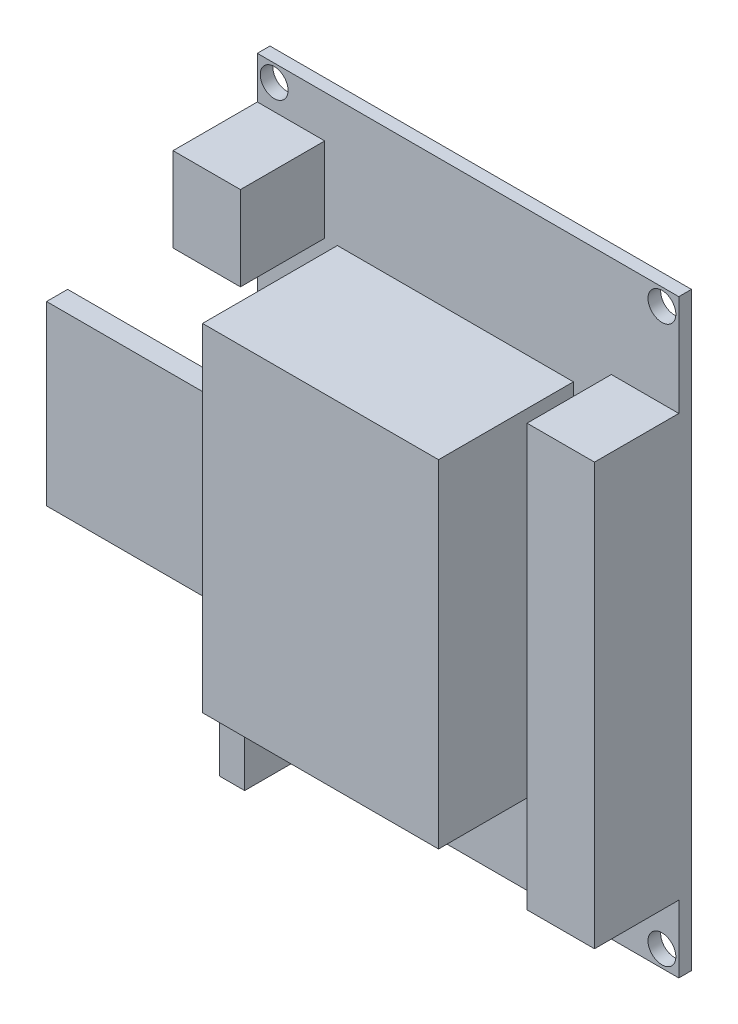
ISO-10303-21;
HEADER;
FILE_DESCRIPTION(('STEP AP214'),'2;1');
FILE_NAME('part.step','',(''),(''),'','','');
FILE_SCHEMA(('AUTOMOTIVE_DESIGN { 1 0 10303 214 1 1 1 1 }'));
ENDSEC;
DATA;
#1=APPLICATION_CONTEXT('core data for automotive mechanical design processes');
#2=APPLICATION_PROTOCOL_DEFINITION('international standard','automotive_design',2000,#1);
#3=PRODUCT_CONTEXT('',#1,'mechanical');
#4=PRODUCT('Part','Part','',(#3));
#5=PRODUCT_RELATED_PRODUCT_CATEGORY('part','',(#4));
#6=PRODUCT_DEFINITION_FORMATION('','',#4);
#7=PRODUCT_DEFINITION_CONTEXT('part definition',#1,'design');
#8=PRODUCT_DEFINITION('design','',#6,#7);
#9=PRODUCT_DEFINITION_SHAPE('','',#8);
#10=(LENGTH_UNIT() NAMED_UNIT(*) SI_UNIT(.MILLI.,.METRE.));
#11=(NAMED_UNIT(*) PLANE_ANGLE_UNIT() SI_UNIT($,.RADIAN.));
#12=(NAMED_UNIT(*) SI_UNIT($,.STERADIAN.) SOLID_ANGLE_UNIT());
#13=UNCERTAINTY_MEASURE_WITH_UNIT(LENGTH_MEASURE(1.E-05),#10,'distance_accuracy_value','');
#14=(GEOMETRIC_REPRESENTATION_CONTEXT(3) GLOBAL_UNCERTAINTY_ASSIGNED_CONTEXT((#13)) GLOBAL_UNIT_ASSIGNED_CONTEXT((#10,
#11,#12)) REPRESENTATION_CONTEXT('',''));
#15=CARTESIAN_POINT('',(0.,0.,0.));
#16=DIRECTION('',(0.,0.,1.));
#17=DIRECTION('',(1.,0.,0.));
#18=AXIS2_PLACEMENT_3D('',#15,#16,#17);
#19=CARTESIAN_POINT('',(0.,0.,0.));
#20=DIRECTION('',(0.,0.,1.));
#21=DIRECTION('',(1.,0.,0.));
#22=AXIS2_PLACEMENT_3D('',#19,#20,#21);
#23=PLANE('',#22);
#24=CARTESIAN_POINT('',(2.00000000000002,2.,0.));
#25=DIRECTION('',(0.,0.,1.));
#26=DIRECTION('',(1.,0.,0.));
#27=AXIS2_PLACEMENT_3D('',#24,#25,#26);
#28=CIRCLE('',#27,1.65);
#29=CARTESIAN_POINT('',(3.65000000000002,2.,0.));
#30=VERTEX_POINT('',#29);
#31=EDGE_CURVE('E549',#30,#30,#28,.F.);
#32=ORIENTED_EDGE('',*,*,#31,.F.);
#33=EDGE_LOOP('',(#32));
#34=FACE_BOUND('',#33,.T.);
#35=CARTESIAN_POINT('',(48.,2.,0.));
#36=DIRECTION('',(0.,0.,1.));
#37=DIRECTION('',(1.,0.,0.));
#38=AXIS2_PLACEMENT_3D('',#35,#36,#37);
#39=CIRCLE('',#38,1.65);
#40=CARTESIAN_POINT('',(49.65,2.,0.));
#41=VERTEX_POINT('',#40);
#42=EDGE_CURVE('E546',#41,#41,#39,.T.);
#43=ORIENTED_EDGE('',*,*,#42,.T.);
#44=EDGE_LOOP('',(#43));
#45=FACE_BOUND('',#44,.T.);
#46=CARTESIAN_POINT('',(48.,68.,0.));
#47=DIRECTION('',(0.,0.,1.));
#48=DIRECTION('',(1.,0.,0.));
#49=AXIS2_PLACEMENT_3D('',#46,#47,#48);
#50=CIRCLE('',#49,1.65);
#51=CARTESIAN_POINT('',(49.65,68.,0.));
#52=VERTEX_POINT('',#51);
#53=EDGE_CURVE('E543',#52,#52,#50,.F.);
#54=ORIENTED_EDGE('',*,*,#53,.F.);
#55=EDGE_LOOP('',(#54));
#56=FACE_BOUND('',#55,.T.);
#57=CARTESIAN_POINT('',(2.,68.,0.));
#58=DIRECTION('',(0.,0.,1.));
#59=DIRECTION('',(1.,0.,0.));
#60=AXIS2_PLACEMENT_3D('',#57,#58,#59);
#61=CIRCLE('',#60,1.65);
#62=CARTESIAN_POINT('',(3.65,68.,0.));
#63=VERTEX_POINT('',#62);
#64=EDGE_CURVE('E533',#63,#63,#61,.T.);
#65=ORIENTED_EDGE('',*,*,#64,.T.);
#66=EDGE_LOOP('',(#65));
#67=FACE_BOUND('',#66,.T.);
#68=DIRECTION('',(1.,0.,0.));
#69=VECTOR('',#68,1.);
#70=CARTESIAN_POINT('',(0.,0.,0.));
#71=LINE('',#70,#69);
#72=CARTESIAN_POINT('',(0.,0.,0.));
#73=VERTEX_POINT('',#72);
#74=CARTESIAN_POINT('',(50.,0.,0.));
#75=VERTEX_POINT('',#74);
#76=EDGE_CURVE('E478',#73,#75,#71,.T.);
#77=ORIENTED_EDGE('',*,*,#76,.F.);
#78=DIRECTION('',(0.,1.,0.));
#79=VECTOR('',#78,1.);
#80=CARTESIAN_POINT('',(0.,0.,0.));
#81=LINE('',#80,#79);
#82=CARTESIAN_POINT('',(0.,70.,0.));
#83=VERTEX_POINT('',#82);
#84=EDGE_CURVE('E530',#73,#83,#81,.T.);
#85=ORIENTED_EDGE('',*,*,#84,.T.);
#86=DIRECTION('',(1.,0.,0.));
#87=VECTOR('',#86,1.);
#88=CARTESIAN_POINT('',(0.,70.,0.));
#89=LINE('',#88,#87);
#90=CARTESIAN_POINT('',(50.,70.,0.));
#91=VERTEX_POINT('',#90);
#92=EDGE_CURVE('E534',#83,#91,#89,.T.);
#93=ORIENTED_EDGE('',*,*,#92,.T.);
#94=DIRECTION('',(0.,1.,0.));
#95=VECTOR('',#94,1.);
#96=CARTESIAN_POINT('',(50.,0.,0.));
#97=LINE('',#96,#95);
#98=EDGE_CURVE('E536',#75,#91,#97,.T.);
#99=ORIENTED_EDGE('',*,*,#98,.F.);
#100=EDGE_LOOP('',(#77,#85,#93,#99));
#101=FACE_BOUND('',#100,.T.);
#102=DIRECTION('',(0.,-1.,0.));
#103=VECTOR('',#102,1.);
#104=CARTESIAN_POINT('',(37.5,0.,0.));
#105=LINE('',#104,#103);
#106=CARTESIAN_POINT('',(37.5,55.,0.));
#107=VERTEX_POINT('',#106);
#108=CARTESIAN_POINT('',(37.5,15.,0.));
#109=VERTEX_POINT('',#108);
#110=EDGE_CURVE('E165',#107,#109,#105,.T.);
#111=ORIENTED_EDGE('',*,*,#110,.F.);
#112=DIRECTION('',(1.,0.,0.));
#113=VECTOR('',#112,1.);
#114=CARTESIAN_POINT('',(0.,55.,0.));
#115=LINE('',#114,#113);
#116=CARTESIAN_POINT('',(9.49999999999999,55.,0.));
#117=VERTEX_POINT('',#116);
#118=EDGE_CURVE('E348',#117,#107,#115,.T.);
#119=ORIENTED_EDGE('',*,*,#118,.F.);
#120=DIRECTION('',(0.,-1.,0.));
#121=VECTOR('',#120,1.);
#122=CARTESIAN_POINT('',(9.50000000000001,0.,0.));
#123=LINE('',#122,#121);
#124=CARTESIAN_POINT('',(9.50000000000001,15.,0.));
#125=VERTEX_POINT('',#124);
#126=EDGE_CURVE('E358',#117,#125,#123,.T.);
#127=ORIENTED_EDGE('',*,*,#126,.T.);
#128=DIRECTION('',(1.,0.,0.));
#129=VECTOR('',#128,1.);
#130=CARTESIAN_POINT('',(0.,15.,0.));
#131=LINE('',#130,#129);
#132=EDGE_CURVE('E355',#125,#109,#131,.T.);
#133=ORIENTED_EDGE('',*,*,#132,.T.);
#134=EDGE_LOOP('',(#111,#119,#127,#133));
#135=FACE_BOUND('',#134,.T.);
#136=ADVANCED_FACE('F150',(#34,#45,#56,#67,#101,#135),#23,.F.);
#137=CARTESIAN_POINT('',(2.00000000000002,2.,1.5));
#138=DIRECTION('',(0.,0.,-1.));
#139=DIRECTION('',(-1.,0.,0.));
#140=AXIS2_PLACEMENT_3D('',#137,#138,#139);
#141=CYLINDRICAL_SURFACE('',#140,1.65);
#142=CARTESIAN_POINT('',(2.00000000000002,2.,1.5));
#143=DIRECTION('',(0.,0.,1.));
#144=DIRECTION('',(1.,0.,0.));
#145=AXIS2_PLACEMENT_3D('',#142,#143,#144);
#146=CIRCLE('',#145,1.65);
#147=CARTESIAN_POINT('',(3.65000000000002,2.,1.5));
#148=VERTEX_POINT('',#147);
#149=EDGE_CURVE('E526',#148,#148,#146,.F.);
#150=ORIENTED_EDGE('',*,*,#149,.F.);
#151=EDGE_LOOP('',(#150));
#152=FACE_BOUND('',#151,.T.);
#153=ORIENTED_EDGE('',*,*,#31,.T.);
#154=EDGE_LOOP('',(#153));
#155=FACE_BOUND('',#154,.T.);
#156=ADVANCED_FACE('F607',(#152,#155),#141,.F.);
#157=CARTESIAN_POINT('',(48.,2.,1.5));
#158=DIRECTION('',(0.,0.,-1.));
#159=DIRECTION('',(-1.,0.,0.));
#160=AXIS2_PLACEMENT_3D('',#157,#158,#159);
#161=CYLINDRICAL_SURFACE('',#160,1.65);
#162=CARTESIAN_POINT('',(48.,2.,1.5));
#163=DIRECTION('',(0.,0.,1.));
#164=DIRECTION('',(1.,0.,0.));
#165=AXIS2_PLACEMENT_3D('',#162,#163,#164);
#166=CIRCLE('',#165,1.65);
#167=CARTESIAN_POINT('',(49.65,2.,1.5));
#168=VERTEX_POINT('',#167);
#169=EDGE_CURVE('E523',#168,#168,#166,.T.);
#170=ORIENTED_EDGE('',*,*,#169,.T.);
#171=EDGE_LOOP('',(#170));
#172=FACE_BOUND('',#171,.T.);
#173=ORIENTED_EDGE('',*,*,#42,.F.);
#174=EDGE_LOOP('',(#173));
#175=FACE_BOUND('',#174,.T.);
#176=ADVANCED_FACE('F615',(#172,#175),#161,.F.);
#177=CARTESIAN_POINT('',(48.,68.,1.5));
#178=DIRECTION('',(0.,0.,-1.));
#179=DIRECTION('',(-1.,0.,0.));
#180=AXIS2_PLACEMENT_3D('',#177,#178,#179);
#181=CYLINDRICAL_SURFACE('',#180,1.65);
#182=CARTESIAN_POINT('',(48.,68.,1.5));
#183=DIRECTION('',(0.,0.,1.));
#184=DIRECTION('',(1.,0.,0.));
#185=AXIS2_PLACEMENT_3D('',#182,#183,#184);
#186=CIRCLE('',#185,1.65);
#187=CARTESIAN_POINT('',(49.65,68.,1.5));
#188=VERTEX_POINT('',#187);
#189=EDGE_CURVE('E520',#188,#188,#186,.F.);
#190=ORIENTED_EDGE('',*,*,#189,.F.);
#191=EDGE_LOOP('',(#190));
#192=FACE_BOUND('',#191,.T.);
#193=ORIENTED_EDGE('',*,*,#53,.T.);
#194=EDGE_LOOP('',(#193));
#195=FACE_BOUND('',#194,.T.);
#196=ADVANCED_FACE('F625',(#192,#195),#181,.F.);
#197=CARTESIAN_POINT('',(2.,68.,1.5));
#198=DIRECTION('',(0.,0.,-1.));
#199=DIRECTION('',(-1.,0.,0.));
#200=AXIS2_PLACEMENT_3D('',#197,#198,#199);
#201=CYLINDRICAL_SURFACE('',#200,1.65);
#202=CARTESIAN_POINT('',(2.,68.,1.5));
#203=DIRECTION('',(0.,0.,1.));
#204=DIRECTION('',(1.,0.,0.));
#205=AXIS2_PLACEMENT_3D('',#202,#203,#204);
#206=CIRCLE('',#205,1.65);
#207=CARTESIAN_POINT('',(3.65,68.,1.5));
#208=VERTEX_POINT('',#207);
#209=EDGE_CURVE('E517',#208,#208,#206,.T.);
#210=ORIENTED_EDGE('',*,*,#209,.T.);
#211=EDGE_LOOP('',(#210));
#212=FACE_BOUND('',#211,.T.);
#213=ORIENTED_EDGE('',*,*,#64,.F.);
#214=EDGE_LOOP('',(#213));
#215=FACE_BOUND('',#214,.T.);
#216=ADVANCED_FACE('F629',(#212,#215),#201,.F.);
#217=CARTESIAN_POINT('',(0.,0.,1.5));
#218=DIRECTION('',(0.,1.,0.));
#219=DIRECTION('',(0.,0.,1.));
#220=AXIS2_PLACEMENT_3D('',#217,#218,#219);
#221=PLANE('',#220);
#222=ORIENTED_EDGE('',*,*,#76,.T.);
#223=DIRECTION('',(0.,0.,-1.));
#224=VECTOR('',#223,1.);
#225=CARTESIAN_POINT('',(50.,0.,1.5));
#226=LINE('',#225,#224);
#227=CARTESIAN_POINT('',(50.,0.,1.5));
#228=VERTEX_POINT('',#227);
#229=EDGE_CURVE('E555',#228,#75,#226,.T.);
#230=ORIENTED_EDGE('',*,*,#229,.F.);
#231=DIRECTION('',(1.,0.,0.));
#232=VECTOR('',#231,1.);
#233=CARTESIAN_POINT('',(0.,0.,1.5));
#234=LINE('',#233,#232);
#235=CARTESIAN_POINT('',(0.,0.,1.5));
#236=VERTEX_POINT('',#235);
#237=EDGE_CURVE('E507',#236,#228,#234,.T.);
#238=ORIENTED_EDGE('',*,*,#237,.F.);
#239=DIRECTION('',(0.,0.,-1.));
#240=VECTOR('',#239,1.);
#241=CARTESIAN_POINT('',(0.,0.,1.5));
#242=LINE('',#241,#240);
#243=EDGE_CURVE('E558',#236,#73,#242,.T.);
#244=ORIENTED_EDGE('',*,*,#243,.T.);
#245=EDGE_LOOP('',(#222,#230,#238,#244));
#246=FACE_BOUND('',#245,.T.);
#247=ADVANCED_FACE('F152',(#246),#221,.F.);
#248=CARTESIAN_POINT('',(50.,0.,1.5));
#249=DIRECTION('',(-1.,0.,0.));
#250=DIRECTION('',(0.,0.,1.));
#251=AXIS2_PLACEMENT_3D('',#248,#249,#250);
#252=PLANE('',#251);
#253=ORIENTED_EDGE('',*,*,#98,.T.);
#254=DIRECTION('',(0.,0.,-1.));
#255=VECTOR('',#254,1.);
#256=CARTESIAN_POINT('',(50.,70.,1.5));
#257=LINE('',#256,#255);
#258=CARTESIAN_POINT('',(50.,70.,1.5));
#259=VERTEX_POINT('',#258);
#260=EDGE_CURVE('E553',#259,#91,#257,.T.);
#261=ORIENTED_EDGE('',*,*,#260,.F.);
#262=DIRECTION('',(0.,1.,0.));
#263=VECTOR('',#262,1.);
#264=CARTESIAN_POINT('',(50.,0.,1.5));
#265=LINE('',#264,#263);
#266=CARTESIAN_POINT('',(50.,58.,1.5));
#267=VERTEX_POINT('',#266);
#268=EDGE_CURVE('E510',#267,#259,#265,.T.);
#269=ORIENTED_EDGE('',*,*,#268,.F.);
#270=DIRECTION('',(0.,0.,-1.));
#271=VECTOR('',#270,1.);
#272=CARTESIAN_POINT('',(50.,58.,11.5));
#273=LINE('',#272,#271);
#274=CARTESIAN_POINT('',(50.,58.,11.5));
#275=VERTEX_POINT('',#274);
#276=EDGE_CURVE('E461',#275,#267,#273,.T.);
#277=ORIENTED_EDGE('',*,*,#276,.F.);
#278=DIRECTION('',(0.,-1.,0.));
#279=VECTOR('',#278,1.);
#280=CARTESIAN_POINT('',(50.,0.,11.5));
#281=LINE('',#280,#279);
#282=CARTESIAN_POINT('',(50.,8.,11.5));
#283=VERTEX_POINT('',#282);
#284=EDGE_CURVE('E458',#275,#283,#281,.T.);
#285=ORIENTED_EDGE('',*,*,#284,.T.);
#286=DIRECTION('',(0.,0.,-1.));
#287=VECTOR('',#286,1.);
#288=CARTESIAN_POINT('',(50.,8.,11.5));
#289=LINE('',#288,#287);
#290=CARTESIAN_POINT('',(50.,8.,1.5));
#291=VERTEX_POINT('',#290);
#292=EDGE_CURVE('E471',#283,#291,#289,.T.);
#293=ORIENTED_EDGE('',*,*,#292,.T.);
#294=EDGE_CURVE('E511',#228,#291,#265,.T.);
#295=ORIENTED_EDGE('',*,*,#294,.F.);
#296=ORIENTED_EDGE('',*,*,#229,.T.);
#297=EDGE_LOOP('',(#253,#261,#269,#277,#285,#293,#295,#296));
#298=FACE_BOUND('',#297,.T.);
#299=ADVANCED_FACE('F640',(#298),#252,.F.);
#300=CARTESIAN_POINT('',(0.,70.,1.5));
#301=DIRECTION('',(0.,1.,0.));
#302=DIRECTION('',(0.,0.,1.));
#303=AXIS2_PLACEMENT_3D('',#300,#301,#302);
#304=PLANE('',#303);
#305=ORIENTED_EDGE('',*,*,#92,.F.);
#306=DIRECTION('',(0.,0.,-1.));
#307=VECTOR('',#306,1.);
#308=CARTESIAN_POINT('',(0.,70.,1.5));
#309=LINE('',#308,#307);
#310=CARTESIAN_POINT('',(0.,70.,1.5));
#311=VERTEX_POINT('',#310);
#312=EDGE_CURVE('E529',#311,#83,#309,.T.);
#313=ORIENTED_EDGE('',*,*,#312,.F.);
#314=DIRECTION('',(1.,0.,0.));
#315=VECTOR('',#314,1.);
#316=CARTESIAN_POINT('',(0.,70.,1.5));
#317=LINE('',#316,#315);
#318=EDGE_CURVE('E514',#311,#259,#317,.T.);
#319=ORIENTED_EDGE('',*,*,#318,.T.);
#320=ORIENTED_EDGE('',*,*,#260,.T.);
#321=EDGE_LOOP('',(#305,#313,#319,#320));
#322=FACE_BOUND('',#321,.T.);
#323=ADVANCED_FACE('F637',(#322),#304,.T.);
#324=CARTESIAN_POINT('',(0.,0.,1.5));
#325=DIRECTION('',(-1.,0.,0.));
#326=DIRECTION('',(0.,0.,1.));
#327=AXIS2_PLACEMENT_3D('',#324,#325,#326);
#328=PLANE('',#327);
#329=ORIENTED_EDGE('',*,*,#84,.F.);
#330=ORIENTED_EDGE('',*,*,#243,.F.);
#331=DIRECTION('',(0.,1.,0.));
#332=VECTOR('',#331,1.);
#333=CARTESIAN_POINT('',(0.,0.,1.5));
#334=LINE('',#333,#332);
#335=CARTESIAN_POINT('',(0.,55.,1.5));
#336=VERTEX_POINT('',#335);
#337=EDGE_CURVE('E504',#236,#336,#334,.T.);
#338=ORIENTED_EDGE('',*,*,#337,.T.);
#339=DIRECTION('',(0.,0.,-1.));
#340=VECTOR('',#339,1.);
#341=CARTESIAN_POINT('',(0.,55.,11.5));
#342=LINE('',#341,#340);
#343=CARTESIAN_POINT('',(0.,55.,11.5));
#344=VERTEX_POINT('',#343);
#345=EDGE_CURVE('E440',#344,#336,#342,.T.);
#346=ORIENTED_EDGE('',*,*,#345,.F.);
#347=DIRECTION('',(0.,1.,0.));
#348=VECTOR('',#347,1.);
#349=CARTESIAN_POINT('',(0.,0.,11.5));
#350=LINE('',#349,#348);
#351=CARTESIAN_POINT('',(0.,65.,11.5));
#352=VERTEX_POINT('',#351);
#353=EDGE_CURVE('E492',#344,#352,#350,.T.);
#354=ORIENTED_EDGE('',*,*,#353,.T.);
#355=DIRECTION('',(0.,0.,-1.));
#356=VECTOR('',#355,1.);
#357=CARTESIAN_POINT('',(0.,65.,11.5));
#358=LINE('',#357,#356);
#359=CARTESIAN_POINT('',(0.,65.,1.5));
#360=VERTEX_POINT('',#359);
#361=EDGE_CURVE('E479',#352,#360,#358,.T.);
#362=ORIENTED_EDGE('',*,*,#361,.T.);
#363=EDGE_CURVE('E508',#360,#311,#334,.T.);
#364=ORIENTED_EDGE('',*,*,#363,.T.);
#365=ORIENTED_EDGE('',*,*,#312,.T.);
#366=EDGE_LOOP('',(#329,#330,#338,#346,#354,#362,#364,#365));
#367=FACE_BOUND('',#366,.T.);
#368=ADVANCED_FACE('F634',(#367),#328,.T.);
#369=CARTESIAN_POINT('',(0.,0.,1.5));
#370=DIRECTION('',(0.,0.,1.));
#371=DIRECTION('',(1.,0.,0.));
#372=AXIS2_PLACEMENT_3D('',#369,#370,#371);
#373=PLANE('',#372);
#374=DIRECTION('',(-1.,0.,0.));
#375=VECTOR('',#374,1.);
#376=CARTESIAN_POINT('',(0.,43.,1.5));
#377=LINE('',#376,#375);
#378=CARTESIAN_POINT('',(6.99999999999999,43.,1.5));
#379=VERTEX_POINT('',#378);
#380=CARTESIAN_POINT('',(3.99999999999999,43.,1.5));
#381=VERTEX_POINT('',#380);
#382=EDGE_CURVE('E12',#379,#381,#377,.T.);
#383=ORIENTED_EDGE('',*,*,#382,.F.);
#384=DIRECTION('',(0.,1.,0.));
#385=VECTOR('',#384,1.);
#386=CARTESIAN_POINT('',(7.,0.,1.5));
#387=LINE('',#386,#385);
#388=CARTESIAN_POINT('',(7.,2.,1.5));
#389=VERTEX_POINT('',#388);
#390=EDGE_CURVE('E561',#389,#379,#387,.T.);
#391=ORIENTED_EDGE('',*,*,#390,.F.);
#392=DIRECTION('',(-1.,0.,0.));
#393=VECTOR('',#392,1.);
#394=CARTESIAN_POINT('',(0.,2.,1.5));
#395=LINE('',#394,#393);
#396=CARTESIAN_POINT('',(4.,2.,1.5));
#397=VERTEX_POINT('',#396);
#398=EDGE_CURVE('E564',#389,#397,#395,.T.);
#399=ORIENTED_EDGE('',*,*,#398,.T.);
#400=DIRECTION('',(0.,1.,0.));
#401=VECTOR('',#400,1.);
#402=CARTESIAN_POINT('',(4.,0.,1.5));
#403=LINE('',#402,#401);
#404=EDGE_CURVE('E158',#397,#381,#403,.T.);
#405=ORIENTED_EDGE('',*,*,#404,.T.);
#406=EDGE_LOOP('',(#383,#391,#399,#405));
#407=FACE_BOUND('',#406,.T.);
#408=DIRECTION('',(-1.,0.,0.));
#409=VECTOR('',#408,1.);
#410=CARTESIAN_POINT('',(0.,15.,1.5));
#411=LINE('',#410,#409);
#412=CARTESIAN_POINT('',(37.5,15.,1.5));
#413=VERTEX_POINT('',#412);
#414=CARTESIAN_POINT('',(9.50000000000001,15.,1.5));
#415=VERTEX_POINT('',#414);
#416=EDGE_CURVE('E408',#413,#415,#411,.T.);
#417=ORIENTED_EDGE('',*,*,#416,.T.);
#418=DIRECTION('',(0.,1.,0.));
#419=VECTOR('',#418,1.);
#420=CARTESIAN_POINT('',(9.50000000000001,0.,1.5));
#421=LINE('',#420,#419);
#422=CARTESIAN_POINT('',(9.49999999999999,55.,1.5));
#423=VERTEX_POINT('',#422);
#424=EDGE_CURVE('E430',#415,#423,#421,.T.);
#425=ORIENTED_EDGE('',*,*,#424,.T.);
#426=DIRECTION('',(-1.,0.,0.));
#427=VECTOR('',#426,1.);
#428=CARTESIAN_POINT('',(0.,55.,1.5));
#429=LINE('',#428,#427);
#430=CARTESIAN_POINT('',(37.5,55.,1.5));
#431=VERTEX_POINT('',#430);
#432=EDGE_CURVE('E432',#431,#423,#429,.T.);
#433=ORIENTED_EDGE('',*,*,#432,.F.);
#434=DIRECTION('',(0.,1.,0.));
#435=VECTOR('',#434,1.);
#436=CARTESIAN_POINT('',(37.5,0.,1.5));
#437=LINE('',#436,#435);
#438=EDGE_CURVE('E421',#413,#431,#437,.T.);
#439=ORIENTED_EDGE('',*,*,#438,.F.);
#440=EDGE_LOOP('',(#417,#425,#433,#439));
#441=FACE_BOUND('',#440,.T.);
#442=DIRECTION('',(-1.,0.,0.));
#443=VECTOR('',#442,1.);
#444=CARTESIAN_POINT('',(0.,58.,1.5));
#445=LINE('',#444,#443);
#446=CARTESIAN_POINT('',(42.,58.,1.5));
#447=VERTEX_POINT('',#446);
#448=EDGE_CURVE('E462',#267,#447,#445,.T.);
#449=ORIENTED_EDGE('',*,*,#448,.F.);
#450=ORIENTED_EDGE('',*,*,#268,.T.);
#451=ORIENTED_EDGE('',*,*,#318,.F.);
#452=ORIENTED_EDGE('',*,*,#363,.F.);
#453=DIRECTION('',(-1.,0.,0.));
#454=VECTOR('',#453,1.);
#455=CARTESIAN_POINT('',(0.,65.,1.5));
#456=LINE('',#455,#454);
#457=CARTESIAN_POINT('',(8.,65.,1.5));
#458=VERTEX_POINT('',#457);
#459=EDGE_CURVE('E465',#458,#360,#456,.T.);
#460=ORIENTED_EDGE('',*,*,#459,.F.);
#461=DIRECTION('',(0.,1.,0.));
#462=VECTOR('',#461,1.);
#463=CARTESIAN_POINT('',(8.00000000000001,0.,1.5));
#464=LINE('',#463,#462);
#465=CARTESIAN_POINT('',(8.,55.,1.5));
#466=VERTEX_POINT('',#465);
#467=EDGE_CURVE('E491',#466,#458,#464,.T.);
#468=ORIENTED_EDGE('',*,*,#467,.F.);
#469=DIRECTION('',(-1.,0.,0.));
#470=VECTOR('',#469,1.);
#471=CARTESIAN_POINT('',(0.,55.,1.5));
#472=LINE('',#471,#470);
#473=EDGE_CURVE('E488',#466,#336,#472,.T.);
#474=ORIENTED_EDGE('',*,*,#473,.T.);
#475=ORIENTED_EDGE('',*,*,#337,.F.);
#476=ORIENTED_EDGE('',*,*,#237,.T.);
#477=ORIENTED_EDGE('',*,*,#294,.T.);
#478=DIRECTION('',(-1.,0.,0.));
#479=VECTOR('',#478,1.);
#480=CARTESIAN_POINT('',(0.,8.,1.5));
#481=LINE('',#480,#479);
#482=CARTESIAN_POINT('',(42.,8.,1.5));
#483=VERTEX_POINT('',#482);
#484=EDGE_CURVE('E452',#291,#483,#481,.T.);
#485=ORIENTED_EDGE('',*,*,#484,.T.);
#486=DIRECTION('',(0.,1.,0.));
#487=VECTOR('',#486,1.);
#488=CARTESIAN_POINT('',(42.,0.,1.5));
#489=LINE('',#488,#487);
#490=EDGE_CURVE('E464',#483,#447,#489,.T.);
#491=ORIENTED_EDGE('',*,*,#490,.T.);
#492=EDGE_LOOP('',(#449,#450,#451,#452,#460,#468,#474,#475,#476,#477,#485,#491));
#493=FACE_BOUND('',#492,.T.);
#494=ORIENTED_EDGE('',*,*,#209,.F.);
#495=EDGE_LOOP('',(#494));
#496=FACE_BOUND('',#495,.T.);
#497=ORIENTED_EDGE('',*,*,#189,.T.);
#498=EDGE_LOOP('',(#497));
#499=FACE_BOUND('',#498,.T.);
#500=ORIENTED_EDGE('',*,*,#169,.F.);
#501=EDGE_LOOP('',(#500));
#502=FACE_BOUND('',#501,.T.);
#503=ORIENTED_EDGE('',*,*,#149,.T.);
#504=EDGE_LOOP('',(#503));
#505=FACE_BOUND('',#504,.T.);
#506=ADVANCED_FACE('F567',(#407,#441,#493,#496,#499,#502,#505),#373,.T.);
#507=CARTESIAN_POINT('',(0.,55.,11.5));
#508=DIRECTION('',(0.,-1.,0.));
#509=DIRECTION('',(0.,0.,-1.));
#510=AXIS2_PLACEMENT_3D('',#507,#508,#509);
#511=PLANE('',#510);
#512=ORIENTED_EDGE('',*,*,#473,.F.);
#513=DIRECTION('',(0.,0.,-1.));
#514=VECTOR('',#513,1.);
#515=CARTESIAN_POINT('',(8.,55.,11.5));
#516=LINE('',#515,#514);
#517=CARTESIAN_POINT('',(8.,55.,11.5));
#518=VERTEX_POINT('',#517);
#519=EDGE_CURVE('E485',#518,#466,#516,.T.);
#520=ORIENTED_EDGE('',*,*,#519,.F.);
#521=DIRECTION('',(-1.,0.,0.));
#522=VECTOR('',#521,1.);
#523=CARTESIAN_POINT('',(0.,55.,11.5));
#524=LINE('',#523,#522);
#525=EDGE_CURVE('E481',#518,#344,#524,.T.);
#526=ORIENTED_EDGE('',*,*,#525,.T.);
#527=ORIENTED_EDGE('',*,*,#345,.T.);
#528=EDGE_LOOP('',(#512,#520,#526,#527));
#529=FACE_BOUND('',#528,.T.);
#530=ADVANCED_FACE('F692',(#529),#511,.T.);
#531=CARTESIAN_POINT('',(8.00000000000001,0.,11.5));
#532=DIRECTION('',(-1.,0.,0.));
#533=DIRECTION('',(0.,-1.,0.));
#534=AXIS2_PLACEMENT_3D('',#531,#532,#533);
#535=PLANE('',#534);
#536=ORIENTED_EDGE('',*,*,#467,.T.);
#537=DIRECTION('',(0.,0.,-1.));
#538=VECTOR('',#537,1.);
#539=CARTESIAN_POINT('',(8.,65.,11.5));
#540=LINE('',#539,#538);
#541=CARTESIAN_POINT('',(8.,65.,11.5));
#542=VERTEX_POINT('',#541);
#543=EDGE_CURVE('E482',#542,#458,#540,.T.);
#544=ORIENTED_EDGE('',*,*,#543,.F.);
#545=DIRECTION('',(0.,1.,0.));
#546=VECTOR('',#545,1.);
#547=CARTESIAN_POINT('',(8.00000000000001,0.,11.5));
#548=LINE('',#547,#546);
#549=EDGE_CURVE('E498',#518,#542,#548,.T.);
#550=ORIENTED_EDGE('',*,*,#549,.F.);
#551=ORIENTED_EDGE('',*,*,#519,.T.);
#552=EDGE_LOOP('',(#536,#544,#550,#551));
#553=FACE_BOUND('',#552,.T.);
#554=ADVANCED_FACE('F688',(#553),#535,.F.);
#555=CARTESIAN_POINT('',(0.,65.,11.5));
#556=DIRECTION('',(0.,-1.,0.));
#557=DIRECTION('',(0.,0.,-1.));
#558=AXIS2_PLACEMENT_3D('',#555,#556,#557);
#559=PLANE('',#558);
#560=ORIENTED_EDGE('',*,*,#459,.T.);
#561=ORIENTED_EDGE('',*,*,#361,.F.);
#562=DIRECTION('',(-1.,0.,0.));
#563=VECTOR('',#562,1.);
#564=CARTESIAN_POINT('',(0.,65.,11.5));
#565=LINE('',#564,#563);
#566=EDGE_CURVE('E500',#542,#352,#565,.T.);
#567=ORIENTED_EDGE('',*,*,#566,.F.);
#568=ORIENTED_EDGE('',*,*,#543,.T.);
#569=EDGE_LOOP('',(#560,#561,#567,#568));
#570=FACE_BOUND('',#569,.T.);
#571=ADVANCED_FACE('F683',(#570),#559,.F.);
#572=CARTESIAN_POINT('',(0.,0.,11.5));
#573=DIRECTION('',(0.,0.,1.));
#574=DIRECTION('',(1.,0.,0.));
#575=AXIS2_PLACEMENT_3D('',#572,#573,#574);
#576=PLANE('',#575);
#577=ORIENTED_EDGE('',*,*,#353,.F.);
#578=ORIENTED_EDGE('',*,*,#525,.F.);
#579=ORIENTED_EDGE('',*,*,#549,.T.);
#580=ORIENTED_EDGE('',*,*,#566,.T.);
#581=EDGE_LOOP('',(#577,#578,#579,#580));
#582=FACE_BOUND('',#581,.T.);
#583=ADVANCED_FACE('F694',(#582),#576,.T.);
#584=CARTESIAN_POINT('',(0.,58.,11.5));
#585=DIRECTION('',(0.,-1.,0.));
#586=DIRECTION('',(0.,0.,-1.));
#587=AXIS2_PLACEMENT_3D('',#584,#585,#586);
#588=PLANE('',#587);
#589=ORIENTED_EDGE('',*,*,#448,.T.);
#590=DIRECTION('',(0.,0.,-1.));
#591=VECTOR('',#590,1.);
#592=CARTESIAN_POINT('',(42.,58.,11.5));
#593=LINE('',#592,#591);
#594=CARTESIAN_POINT('',(42.,58.,11.5));
#595=VERTEX_POINT('',#594);
#596=EDGE_CURVE('E475',#595,#447,#593,.T.);
#597=ORIENTED_EDGE('',*,*,#596,.F.);
#598=DIRECTION('',(-1.,0.,0.));
#599=VECTOR('',#598,1.);
#600=CARTESIAN_POINT('',(0.,58.,11.5));
#601=LINE('',#600,#599);
#602=EDGE_CURVE('E449',#275,#595,#601,.T.);
#603=ORIENTED_EDGE('',*,*,#602,.F.);
#604=ORIENTED_EDGE('',*,*,#276,.T.);
#605=EDGE_LOOP('',(#589,#597,#603,#604));
#606=FACE_BOUND('',#605,.T.);
#607=ADVANCED_FACE('F668',(#606),#588,.F.);
#608=CARTESIAN_POINT('',(42.,0.,11.5));
#609=DIRECTION('',(-1.,0.,0.));
#610=DIRECTION('',(0.,-1.,0.));
#611=AXIS2_PLACEMENT_3D('',#608,#609,#610);
#612=PLANE('',#611);
#613=ORIENTED_EDGE('',*,*,#490,.F.);
#614=DIRECTION('',(0.,0.,-1.));
#615=VECTOR('',#614,1.);
#616=CARTESIAN_POINT('',(42.,8.,11.5));
#617=LINE('',#616,#615);
#618=CARTESIAN_POINT('',(42.,8.,11.5));
#619=VERTEX_POINT('',#618);
#620=EDGE_CURVE('E473',#619,#483,#617,.T.);
#621=ORIENTED_EDGE('',*,*,#620,.F.);
#622=DIRECTION('',(0.,1.,0.));
#623=VECTOR('',#622,1.);
#624=CARTESIAN_POINT('',(42.,0.,11.5));
#625=LINE('',#624,#623);
#626=EDGE_CURVE('E451',#619,#595,#625,.T.);
#627=ORIENTED_EDGE('',*,*,#626,.T.);
#628=ORIENTED_EDGE('',*,*,#596,.T.);
#629=EDGE_LOOP('',(#613,#621,#627,#628));
#630=FACE_BOUND('',#629,.T.);
#631=ADVANCED_FACE('F700',(#630),#612,.T.);
#632=CARTESIAN_POINT('',(0.,8.,11.5));
#633=DIRECTION('',(0.,-1.,0.));
#634=DIRECTION('',(0.,0.,-1.));
#635=AXIS2_PLACEMENT_3D('',#632,#633,#634);
#636=PLANE('',#635);
#637=ORIENTED_EDGE('',*,*,#484,.F.);
#638=ORIENTED_EDGE('',*,*,#292,.F.);
#639=DIRECTION('',(-1.,0.,0.));
#640=VECTOR('',#639,1.);
#641=CARTESIAN_POINT('',(0.,8.,11.5));
#642=LINE('',#641,#640);
#643=EDGE_CURVE('E455',#283,#619,#642,.T.);
#644=ORIENTED_EDGE('',*,*,#643,.T.);
#645=ORIENTED_EDGE('',*,*,#620,.T.);
#646=EDGE_LOOP('',(#637,#638,#644,#645));
#647=FACE_BOUND('',#646,.T.);
#648=ADVANCED_FACE('F675',(#647),#636,.T.);
#649=CARTESIAN_POINT('',(0.,0.,11.5));
#650=DIRECTION('',(0.,0.,-1.));
#651=DIRECTION('',(-1.,0.,0.));
#652=AXIS2_PLACEMENT_3D('',#649,#650,#651);
#653=PLANE('',#652);
#654=ORIENTED_EDGE('',*,*,#602,.T.);
#655=ORIENTED_EDGE('',*,*,#626,.F.);
#656=ORIENTED_EDGE('',*,*,#643,.F.);
#657=ORIENTED_EDGE('',*,*,#284,.F.);
#658=EDGE_LOOP('',(#654,#655,#656,#657));
#659=FACE_BOUND('',#658,.T.);
#660=ADVANCED_FACE('F672',(#659),#653,.F.);
#661=CARTESIAN_POINT('',(0.,15.,17.5));
#662=DIRECTION('',(0.,-1.,0.));
#663=DIRECTION('',(0.,0.,-1.));
#664=AXIS2_PLACEMENT_3D('',#661,#662,#663);
#665=PLANE('',#664);
#666=ORIENTED_EDGE('',*,*,#416,.F.);
#667=DIRECTION('',(0.,0.,-1.));
#668=VECTOR('',#667,1.);
#669=CARTESIAN_POINT('',(37.5,15.,17.5));
#670=LINE('',#669,#668);
#671=CARTESIAN_POINT('',(37.5,15.,17.5));
#672=VERTEX_POINT('',#671);
#673=EDGE_CURVE('E437',#672,#413,#670,.T.);
#674=ORIENTED_EDGE('',*,*,#673,.F.);
#675=DIRECTION('',(-1.,0.,0.));
#676=VECTOR('',#675,1.);
#677=CARTESIAN_POINT('',(0.,15.,17.5));
#678=LINE('',#677,#676);
#679=CARTESIAN_POINT('',(9.50000000000001,15.,17.5));
#680=VERTEX_POINT('',#679);
#681=EDGE_CURVE('E417',#672,#680,#678,.T.);
#682=ORIENTED_EDGE('',*,*,#681,.T.);
#683=DIRECTION('',(0.,0.,-1.));
#684=VECTOR('',#683,1.);
#685=CARTESIAN_POINT('',(9.50000000000001,15.,17.5));
#686=LINE('',#685,#684);
#687=EDGE_CURVE('E428',#680,#415,#686,.T.);
#688=ORIENTED_EDGE('',*,*,#687,.T.);
#689=EDGE_LOOP('',(#666,#674,#682,#688));
#690=FACE_BOUND('',#689,.T.);
#691=ADVANCED_FACE('F715',(#690),#665,.T.);
#692=CARTESIAN_POINT('',(37.5,0.,17.5));
#693=DIRECTION('',(-1.,0.,0.));
#694=DIRECTION('',(0.,-1.,0.));
#695=AXIS2_PLACEMENT_3D('',#692,#693,#694);
#696=PLANE('',#695);
#697=ORIENTED_EDGE('',*,*,#438,.T.);
#698=DIRECTION('',(0.,0.,-1.));
#699=VECTOR('',#698,1.);
#700=CARTESIAN_POINT('',(37.5,55.,17.5));
#701=LINE('',#700,#699);
#702=CARTESIAN_POINT('',(37.5,55.,17.5));
#703=VERTEX_POINT('',#702);
#704=EDGE_CURVE('E441',#703,#431,#701,.T.);
#705=ORIENTED_EDGE('',*,*,#704,.F.);
#706=DIRECTION('',(0.,1.,0.));
#707=VECTOR('',#706,1.);
#708=CARTESIAN_POINT('',(37.5,0.,17.5));
#709=LINE('',#708,#707);
#710=EDGE_CURVE('E426',#672,#703,#709,.T.);
#711=ORIENTED_EDGE('',*,*,#710,.F.);
#712=ORIENTED_EDGE('',*,*,#673,.T.);
#713=EDGE_LOOP('',(#697,#705,#711,#712));
#714=FACE_BOUND('',#713,.T.);
#715=ADVANCED_FACE('F718',(#714),#696,.F.);
#716=CARTESIAN_POINT('',(0.,55.,17.5));
#717=DIRECTION('',(0.,-1.,0.));
#718=DIRECTION('',(1.,0.,0.));
#719=AXIS2_PLACEMENT_3D('',#716,#717,#718);
#720=PLANE('',#719);
#721=ORIENTED_EDGE('',*,*,#432,.T.);
#722=DIRECTION('',(0.,0.,-1.));
#723=VECTOR('',#722,1.);
#724=CARTESIAN_POINT('',(9.49999999999999,55.,17.5));
#725=LINE('',#724,#723);
#726=CARTESIAN_POINT('',(9.49999999999999,55.,17.5));
#727=VERTEX_POINT('',#726);
#728=EDGE_CURVE('E444',#727,#423,#725,.T.);
#729=ORIENTED_EDGE('',*,*,#728,.F.);
#730=DIRECTION('',(-1.,0.,0.));
#731=VECTOR('',#730,1.);
#732=CARTESIAN_POINT('',(0.,55.,17.5));
#733=LINE('',#732,#731);
#734=EDGE_CURVE('E424',#703,#727,#733,.T.);
#735=ORIENTED_EDGE('',*,*,#734,.F.);
#736=ORIENTED_EDGE('',*,*,#704,.T.);
#737=EDGE_LOOP('',(#721,#729,#735,#736));
#738=FACE_BOUND('',#737,.T.);
#739=ADVANCED_FACE('F724',(#738),#720,.F.);
#740=CARTESIAN_POINT('',(9.50000000000001,0.,17.5));
#741=DIRECTION('',(-1.,0.,0.));
#742=DIRECTION('',(0.,-1.,0.));
#743=AXIS2_PLACEMENT_3D('',#740,#741,#742);
#744=PLANE('',#743);
#745=ORIENTED_EDGE('',*,*,#424,.F.);
#746=ORIENTED_EDGE('',*,*,#687,.F.);
#747=DIRECTION('',(0.,1.,0.));
#748=VECTOR('',#747,1.);
#749=CARTESIAN_POINT('',(9.50000000000001,0.,17.5));
#750=LINE('',#749,#748);
#751=EDGE_CURVE('E420',#680,#727,#750,.T.);
#752=ORIENTED_EDGE('',*,*,#751,.T.);
#753=ORIENTED_EDGE('',*,*,#728,.T.);
#754=EDGE_LOOP('',(#745,#746,#752,#753));
#755=FACE_BOUND('',#754,.T.);
#756=ADVANCED_FACE('F720',(#755),#744,.T.);
#757=CARTESIAN_POINT('',(0.,0.,17.5));
#758=DIRECTION('',(0.,0.,-1.));
#759=DIRECTION('',(-1.,0.,0.));
#760=AXIS2_PLACEMENT_3D('',#757,#758,#759);
#761=PLANE('',#760);
#762=ORIENTED_EDGE('',*,*,#681,.F.);
#763=ORIENTED_EDGE('',*,*,#710,.T.);
#764=ORIENTED_EDGE('',*,*,#734,.T.);
#765=ORIENTED_EDGE('',*,*,#751,.F.);
#766=EDGE_LOOP('',(#762,#763,#764,#765));
#767=FACE_BOUND('',#766,.T.);
#768=ADVANCED_FACE('F723',(#767),#761,.F.);
#769=CARTESIAN_POINT('',(3.99999999999999,43.,10.));
#770=DIRECTION('',(0.,1.,0.));
#771=DIRECTION('',(0.,0.,1.));
#772=AXIS2_PLACEMENT_3D('',#769,#770,#771);
#773=PLANE('',#772);
#774=DIRECTION('',(0.,0.,-1.));
#775=VECTOR('',#774,1.);
#776=CARTESIAN_POINT('',(6.99999999999999,43.,10.));
#777=LINE('',#776,#775);
#778=CARTESIAN_POINT('',(6.99999999999999,43.,12.5));
#779=VERTEX_POINT('',#778);
#780=EDGE_CURVE('E404',#779,#379,#777,.T.);
#781=ORIENTED_EDGE('',*,*,#780,.T.);
#782=ORIENTED_EDGE('',*,*,#382,.T.);
#783=DIRECTION('',(0.,0.,-1.));
#784=VECTOR('',#783,1.);
#785=CARTESIAN_POINT('',(3.99999999999999,43.,10.));
#786=LINE('',#785,#784);
#787=CARTESIAN_POINT('',(3.99999999999999,43.,10.));
#788=VERTEX_POINT('',#787);
#789=EDGE_CURVE('E405',#788,#381,#786,.T.);
#790=ORIENTED_EDGE('',*,*,#789,.F.);
#791=DIRECTION('',(-1.,0.,0.));
#792=VECTOR('',#791,1.);
#793=CARTESIAN_POINT('',(0.,43.,10.));
#794=LINE('',#793,#792);
#795=CARTESIAN_POINT('',(-14.,43.,10.));
#796=VERTEX_POINT('',#795);
#797=EDGE_CURVE('E375',#788,#796,#794,.T.);
#798=ORIENTED_EDGE('',*,*,#797,.T.);
#799=DIRECTION('',(0.,0.,-1.));
#800=VECTOR('',#799,1.);
#801=CARTESIAN_POINT('',(-14.,43.,12.5));
#802=LINE('',#801,#800);
#803=CARTESIAN_POINT('',(-14.,43.,12.5));
#804=VERTEX_POINT('',#803);
#805=EDGE_CURVE('E390',#804,#796,#802,.T.);
#806=ORIENTED_EDGE('',*,*,#805,.F.);
#807=DIRECTION('',(-1.,0.,0.));
#808=VECTOR('',#807,1.);
#809=CARTESIAN_POINT('',(0.,43.,12.5));
#810=LINE('',#809,#808);
#811=EDGE_CURVE('E380',#779,#804,#810,.T.);
#812=ORIENTED_EDGE('',*,*,#811,.F.);
#813=EDGE_LOOP('',(#781,#782,#790,#798,#806,#812));
#814=FACE_BOUND('',#813,.T.);
#815=ADVANCED_FACE('F574',(#814),#773,.T.);
#816=CARTESIAN_POINT('',(3.99999999999999,43.,10.));
#817=DIRECTION('',(1.,0.,0.));
#818=DIRECTION('',(0.,1.,0.));
#819=AXIS2_PLACEMENT_3D('',#816,#817,#818);
#820=PLANE('',#819);
#821=ORIENTED_EDGE('',*,*,#404,.F.);
#822=DIRECTION('',(0.,0.,-1.));
#823=VECTOR('',#822,1.);
#824=CARTESIAN_POINT('',(4.,2.,10.));
#825=LINE('',#824,#823);
#826=CARTESIAN_POINT('',(4.,2.,10.));
#827=VERTEX_POINT('',#826);
#828=EDGE_CURVE('E409',#827,#397,#825,.T.);
#829=ORIENTED_EDGE('',*,*,#828,.F.);
#830=DIRECTION('',(0.,-1.,0.));
#831=VECTOR('',#830,1.);
#832=CARTESIAN_POINT('',(3.99999999999999,43.,10.));
#833=LINE('',#832,#831);
#834=CARTESIAN_POINT('',(4.,22.,10.));
#835=VERTEX_POINT('',#834);
#836=EDGE_CURVE('E401',#835,#827,#833,.T.);
#837=ORIENTED_EDGE('',*,*,#836,.F.);
#838=EDGE_CURVE('E402',#788,#835,#833,.T.);
#839=ORIENTED_EDGE('',*,*,#838,.F.);
#840=ORIENTED_EDGE('',*,*,#789,.T.);
#841=EDGE_LOOP('',(#821,#829,#837,#839,#840));
#842=FACE_BOUND('',#841,.T.);
#843=ADVANCED_FACE('F577',(#842),#820,.F.);
#844=CARTESIAN_POINT('',(4.,2.,10.));
#845=DIRECTION('',(0.,1.,0.));
#846=DIRECTION('',(0.,0.,1.));
#847=AXIS2_PLACEMENT_3D('',#844,#845,#846);
#848=PLANE('',#847);
#849=ORIENTED_EDGE('',*,*,#398,.F.);
#850=DIRECTION('',(0.,0.,-1.));
#851=VECTOR('',#850,1.);
#852=CARTESIAN_POINT('',(7.,2.,10.));
#853=LINE('',#852,#851);
#854=CARTESIAN_POINT('',(7.,2.,10.));
#855=VERTEX_POINT('',#854);
#856=EDGE_CURVE('E412',#855,#389,#853,.T.);
#857=ORIENTED_EDGE('',*,*,#856,.F.);
#858=DIRECTION('',(1.,0.,0.));
#859=VECTOR('',#858,1.);
#860=CARTESIAN_POINT('',(4.,2.,10.));
#861=LINE('',#860,#859);
#862=EDGE_CURVE('E398',#827,#855,#861,.T.);
#863=ORIENTED_EDGE('',*,*,#862,.F.);
#864=ORIENTED_EDGE('',*,*,#828,.T.);
#865=EDGE_LOOP('',(#849,#857,#863,#864));
#866=FACE_BOUND('',#865,.T.);
#867=ADVANCED_FACE('F739',(#866),#848,.F.);
#868=CARTESIAN_POINT('',(6.99999999999999,43.,10.));
#869=DIRECTION('',(1.,0.,0.));
#870=DIRECTION('',(0.,1.,0.));
#871=AXIS2_PLACEMENT_3D('',#868,#869,#870);
#872=PLANE('',#871);
#873=ORIENTED_EDGE('',*,*,#856,.T.);
#874=ORIENTED_EDGE('',*,*,#390,.T.);
#875=ORIENTED_EDGE('',*,*,#780,.F.);
#876=DIRECTION('',(0.,-1.,0.));
#877=VECTOR('',#876,1.);
#878=CARTESIAN_POINT('',(7.,0.,12.5));
#879=LINE('',#878,#877);
#880=CARTESIAN_POINT('',(6.99999999999999,22.,12.5));
#881=VERTEX_POINT('',#880);
#882=EDGE_CURVE('E371',#779,#881,#879,.T.);
#883=ORIENTED_EDGE('',*,*,#882,.T.);
#884=DIRECTION('',(0.,0.,-1.));
#885=VECTOR('',#884,1.);
#886=CARTESIAN_POINT('',(6.99999999999999,22.,12.5));
#887=LINE('',#886,#885);
#888=CARTESIAN_POINT('',(6.99999999999999,22.,10.));
#889=VERTEX_POINT('',#888);
#890=EDGE_CURVE('E382',#881,#889,#887,.T.);
#891=ORIENTED_EDGE('',*,*,#890,.T.);
#892=DIRECTION('',(0.,-1.,0.));
#893=VECTOR('',#892,1.);
#894=CARTESIAN_POINT('',(6.99999999999999,43.,10.));
#895=LINE('',#894,#893);
#896=EDGE_CURVE('E393',#889,#855,#895,.T.);
#897=ORIENTED_EDGE('',*,*,#896,.T.);
#898=EDGE_LOOP('',(#873,#874,#875,#883,#891,#897));
#899=FACE_BOUND('',#898,.T.);
#900=ADVANCED_FACE('F593',(#899),#872,.T.);
#901=CARTESIAN_POINT('',(0.,0.,10.));
#902=DIRECTION('',(0.,0.,-1.));
#903=DIRECTION('',(-1.,0.,0.));
#904=AXIS2_PLACEMENT_3D('',#901,#902,#903);
#905=PLANE('',#904);
#906=ORIENTED_EDGE('',*,*,#896,.F.);
#907=DIRECTION('',(-1.,0.,0.));
#908=VECTOR('',#907,1.);
#909=CARTESIAN_POINT('',(0.,22.,10.));
#910=LINE('',#909,#908);
#911=EDGE_CURVE('E383',#889,#835,#910,.T.);
#912=ORIENTED_EDGE('',*,*,#911,.T.);
#913=ORIENTED_EDGE('',*,*,#836,.T.);
#914=ORIENTED_EDGE('',*,*,#862,.T.);
#915=EDGE_LOOP('',(#906,#912,#913,#914));
#916=FACE_BOUND('',#915,.T.);
#917=ADVANCED_FACE('F584',(#916),#905,.F.);
#918=CARTESIAN_POINT('',(-14.,0.,12.5));
#919=DIRECTION('',(1.,0.,0.));
#920=DIRECTION('',(0.,1.,0.));
#921=AXIS2_PLACEMENT_3D('',#918,#919,#920);
#922=PLANE('',#921);
#923=DIRECTION('',(0.,-1.,0.));
#924=VECTOR('',#923,1.);
#925=CARTESIAN_POINT('',(-14.,0.,10.));
#926=LINE('',#925,#924);
#927=CARTESIAN_POINT('',(-14.,22.,10.));
#928=VERTEX_POINT('',#927);
#929=EDGE_CURVE('E386',#796,#928,#926,.T.);
#930=ORIENTED_EDGE('',*,*,#929,.T.);
#931=DIRECTION('',(0.,0.,-1.));
#932=VECTOR('',#931,1.);
#933=CARTESIAN_POINT('',(-14.,22.,12.5));
#934=LINE('',#933,#932);
#935=CARTESIAN_POINT('',(-14.,22.,12.5));
#936=VERTEX_POINT('',#935);
#937=EDGE_CURVE('E394',#936,#928,#934,.T.);
#938=ORIENTED_EDGE('',*,*,#937,.F.);
#939=DIRECTION('',(0.,-1.,0.));
#940=VECTOR('',#939,1.);
#941=CARTESIAN_POINT('',(-14.,0.,12.5));
#942=LINE('',#941,#940);
#943=EDGE_CURVE('E378',#804,#936,#942,.T.);
#944=ORIENTED_EDGE('',*,*,#943,.F.);
#945=ORIENTED_EDGE('',*,*,#805,.T.);
#946=EDGE_LOOP('',(#930,#938,#944,#945));
#947=FACE_BOUND('',#946,.T.);
#948=ADVANCED_FACE('F596',(#947),#922,.F.);
#949=CARTESIAN_POINT('',(0.,22.,12.5));
#950=DIRECTION('',(0.,-1.,0.));
#951=DIRECTION('',(0.,0.,-1.));
#952=AXIS2_PLACEMENT_3D('',#949,#950,#951);
#953=PLANE('',#952);
#954=ORIENTED_EDGE('',*,*,#911,.F.);
#955=ORIENTED_EDGE('',*,*,#890,.F.);
#956=DIRECTION('',(-1.,0.,0.));
#957=VECTOR('',#956,1.);
#958=CARTESIAN_POINT('',(0.,22.,12.5));
#959=LINE('',#958,#957);
#960=EDGE_CURVE('E374',#881,#936,#959,.T.);
#961=ORIENTED_EDGE('',*,*,#960,.T.);
#962=ORIENTED_EDGE('',*,*,#937,.T.);
#963=EDGE_CURVE('E173',#835,#928,#910,.T.);
#964=ORIENTED_EDGE('',*,*,#963,.F.);
#965=EDGE_LOOP('',(#954,#955,#961,#962,#964));
#966=FACE_BOUND('',#965,.T.);
#967=ADVANCED_FACE('F585',(#966),#953,.T.);
#968=CARTESIAN_POINT('',(0.,0.,12.5));
#969=DIRECTION('',(0.,0.,-1.));
#970=DIRECTION('',(-1.,0.,0.));
#971=AXIS2_PLACEMENT_3D('',#968,#969,#970);
#972=PLANE('',#971);
#973=ORIENTED_EDGE('',*,*,#882,.F.);
#974=ORIENTED_EDGE('',*,*,#811,.T.);
#975=ORIENTED_EDGE('',*,*,#943,.T.);
#976=ORIENTED_EDGE('',*,*,#960,.F.);
#977=EDGE_LOOP('',(#973,#974,#975,#976));
#978=FACE_BOUND('',#977,.T.);
#979=ADVANCED_FACE('F590',(#978),#972,.F.);
#980=CARTESIAN_POINT('',(0.,0.,10.));
#981=DIRECTION('',(0.,0.,-1.));
#982=DIRECTION('',(-1.,0.,0.));
#983=AXIS2_PLACEMENT_3D('',#980,#981,#982);
#984=PLANE('',#983);
#985=ORIENTED_EDGE('',*,*,#797,.F.);
#986=ORIENTED_EDGE('',*,*,#838,.T.);
#987=ORIENTED_EDGE('',*,*,#963,.T.);
#988=ORIENTED_EDGE('',*,*,#929,.F.);
#989=EDGE_LOOP('',(#985,#986,#987,#988));
#990=FACE_BOUND('',#989,.T.);
#991=ADVANCED_FACE('F580',(#990),#984,.T.);
#992=CARTESIAN_POINT('',(37.5,0.,-6.));
#993=DIRECTION('',(-1.,0.,0.));
#994=DIRECTION('',(0.,-1.,0.));
#995=AXIS2_PLACEMENT_3D('',#992,#993,#994);
#996=PLANE('',#995);
#997=ORIENTED_EDGE('',*,*,#110,.T.);
#998=DIRECTION('',(0.,0.,1.));
#999=VECTOR('',#998,1.);
#1000=CARTESIAN_POINT('',(37.5,15.,-6.));
#1001=LINE('',#1000,#999);
#1002=CARTESIAN_POINT('',(37.5,15.,-6.));
#1003=VERTEX_POINT('',#1002);
#1004=EDGE_CURVE('E353',#1003,#109,#1001,.T.);
#1005=ORIENTED_EDGE('',*,*,#1004,.F.);
#1006=DIRECTION('',(0.,-1.,0.));
#1007=VECTOR('',#1006,1.);
#1008=CARTESIAN_POINT('',(37.5,0.,-6.));
#1009=LINE('',#1008,#1007);
#1010=CARTESIAN_POINT('',(37.5,55.,-6.));
#1011=VERTEX_POINT('',#1010);
#1012=EDGE_CURVE('E340',#1011,#1003,#1009,.T.);
#1013=ORIENTED_EDGE('',*,*,#1012,.F.);
#1014=DIRECTION('',(0.,0.,1.));
#1015=VECTOR('',#1014,1.);
#1016=CARTESIAN_POINT('',(37.5,55.,-6.));
#1017=LINE('',#1016,#1015);
#1018=EDGE_CURVE('E345',#1011,#107,#1017,.T.);
#1019=ORIENTED_EDGE('',*,*,#1018,.T.);
#1020=EDGE_LOOP('',(#997,#1005,#1013,#1019));
#1021=FACE_BOUND('',#1020,.T.);
#1022=ADVANCED_FACE('F352',(#1021),#996,.F.);
#1023=CARTESIAN_POINT('',(0.,15.,-6.));
#1024=DIRECTION('',(0.,-1.,0.));
#1025=DIRECTION('',(0.,0.,-1.));
#1026=AXIS2_PLACEMENT_3D('',#1023,#1024,#1025);
#1027=PLANE('',#1026);
#1028=ORIENTED_EDGE('',*,*,#132,.F.);
#1029=DIRECTION('',(0.,0.,1.));
#1030=VECTOR('',#1029,1.);
#1031=CARTESIAN_POINT('',(9.50000000000001,15.,-6.));
#1032=LINE('',#1031,#1030);
#1033=CARTESIAN_POINT('',(9.50000000000001,15.,-6.));
#1034=VERTEX_POINT('',#1033);
#1035=EDGE_CURVE('E368',#1034,#125,#1032,.T.);
#1036=ORIENTED_EDGE('',*,*,#1035,.F.);
#1037=DIRECTION('',(1.,0.,0.));
#1038=VECTOR('',#1037,1.);
#1039=CARTESIAN_POINT('',(0.,15.,-6.));
#1040=LINE('',#1039,#1038);
#1041=EDGE_CURVE('E350',#1034,#1003,#1040,.T.);
#1042=ORIENTED_EDGE('',*,*,#1041,.T.);
#1043=ORIENTED_EDGE('',*,*,#1004,.T.);
#1044=EDGE_LOOP('',(#1028,#1036,#1042,#1043));
#1045=FACE_BOUND('',#1044,.T.);
#1046=ADVANCED_FACE('F963',(#1045),#1027,.T.);
#1047=CARTESIAN_POINT('',(9.50000000000001,0.,-6.));
#1048=DIRECTION('',(-1.,0.,0.));
#1049=DIRECTION('',(0.,-1.,0.));
#1050=AXIS2_PLACEMENT_3D('',#1047,#1048,#1049);
#1051=PLANE('',#1050);
#1052=ORIENTED_EDGE('',*,*,#126,.F.);
#1053=DIRECTION('',(0.,0.,1.));
#1054=VECTOR('',#1053,1.);
#1055=CARTESIAN_POINT('',(9.49999999999999,55.,-6.));
#1056=LINE('',#1055,#1054);
#1057=CARTESIAN_POINT('',(9.49999999999999,55.,-6.));
#1058=VERTEX_POINT('',#1057);
#1059=EDGE_CURVE('E349',#1058,#117,#1056,.T.);
#1060=ORIENTED_EDGE('',*,*,#1059,.F.);
#1061=DIRECTION('',(0.,-1.,0.));
#1062=VECTOR('',#1061,1.);
#1063=CARTESIAN_POINT('',(9.50000000000001,0.,-6.));
#1064=LINE('',#1063,#1062);
#1065=EDGE_CURVE('E342',#1058,#1034,#1064,.T.);
#1066=ORIENTED_EDGE('',*,*,#1065,.T.);
#1067=ORIENTED_EDGE('',*,*,#1035,.T.);
#1068=EDGE_LOOP('',(#1052,#1060,#1066,#1067));
#1069=FACE_BOUND('',#1068,.T.);
#1070=ADVANCED_FACE('F971',(#1069),#1051,.T.);
#1071=CARTESIAN_POINT('',(0.,55.,-6.));
#1072=DIRECTION('',(0.,-1.,0.));
#1073=DIRECTION('',(1.,0.,0.));
#1074=AXIS2_PLACEMENT_3D('',#1071,#1072,#1073);
#1075=PLANE('',#1074);
#1076=ORIENTED_EDGE('',*,*,#118,.T.);
#1077=ORIENTED_EDGE('',*,*,#1018,.F.);
#1078=DIRECTION('',(1.,0.,0.));
#1079=VECTOR('',#1078,1.);
#1080=CARTESIAN_POINT('',(0.,55.,-6.));
#1081=LINE('',#1080,#1079);
#1082=EDGE_CURVE('E335',#1058,#1011,#1081,.T.);
#1083=ORIENTED_EDGE('',*,*,#1082,.F.);
#1084=ORIENTED_EDGE('',*,*,#1059,.T.);
#1085=EDGE_LOOP('',(#1076,#1077,#1083,#1084));
#1086=FACE_BOUND('',#1085,.T.);
#1087=ADVANCED_FACE('F346',(#1086),#1075,.F.);
#1088=CARTESIAN_POINT('',(0.,0.,-6.));
#1089=DIRECTION('',(0.,0.,1.));
#1090=DIRECTION('',(1.,0.,0.));
#1091=AXIS2_PLACEMENT_3D('',#1088,#1089,#1090);
#1092=PLANE('',#1091);
#1093=ORIENTED_EDGE('',*,*,#1012,.T.);
#1094=ORIENTED_EDGE('',*,*,#1041,.F.);
#1095=ORIENTED_EDGE('',*,*,#1065,.F.);
#1096=ORIENTED_EDGE('',*,*,#1082,.T.);
#1097=EDGE_LOOP('',(#1093,#1094,#1095,#1096));
#1098=FACE_BOUND('',#1097,.T.);
#1099=ADVANCED_FACE('F337',(#1098),#1092,.F.);
#1100=CLOSED_SHELL('',(#136,#156,#176,#196,#216,#247,#299,#323,#368,#506,#530,#554,#571,#583,
#607,#631,#648,#660,#691,#715,#739,#756,#768,#815,#843,#867,#900,#917,#948,#967,#979,#991,#1022,
#1046,#1070,#1087,#1099));
#1101=MANIFOLD_SOLID_BREP('B2',#1100);
#1102=ADVANCED_BREP_SHAPE_REPRESENTATION('',(#18,#1101),#14);
#1103=SHAPE_DEFINITION_REPRESENTATION(#9,#1102);
ENDSEC;
END-ISO-10303-21;
